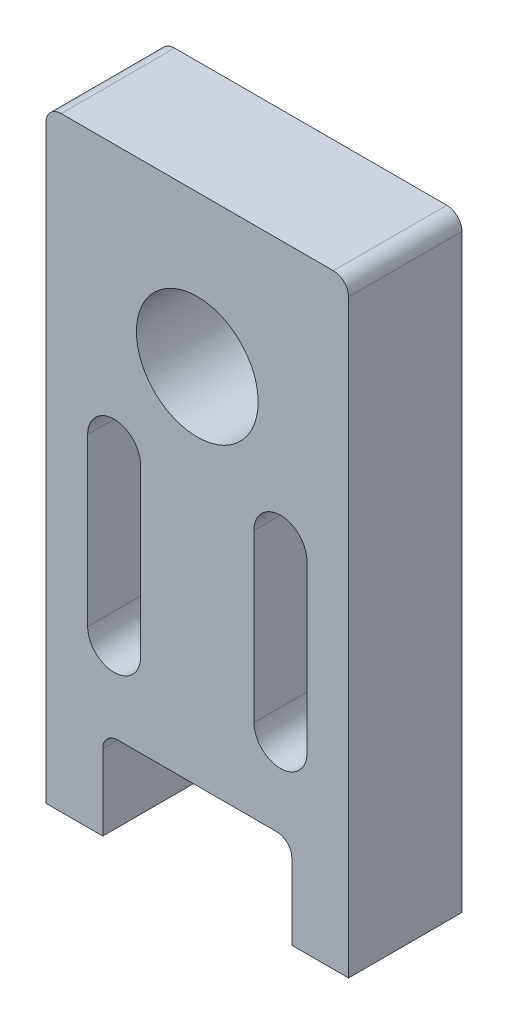
ISO-10303-21;
HEADER;
FILE_DESCRIPTION(('STEP AP214'),'2;1');
FILE_NAME('part.step','',(''),(''),'','','');
FILE_SCHEMA(('AUTOMOTIVE_DESIGN { 1 0 10303 214 1 1 1 1 }'));
ENDSEC;
DATA;
#1=APPLICATION_CONTEXT('core data for automotive mechanical design processes');
#2=APPLICATION_PROTOCOL_DEFINITION('international standard','automotive_design',2000,#1);
#3=PRODUCT_CONTEXT('',#1,'mechanical');
#4=PRODUCT('Part','Part','',(#3));
#5=PRODUCT_RELATED_PRODUCT_CATEGORY('part','',(#4));
#6=PRODUCT_DEFINITION_FORMATION('','',#4);
#7=PRODUCT_DEFINITION_CONTEXT('part definition',#1,'design');
#8=PRODUCT_DEFINITION('design','',#6,#7);
#9=PRODUCT_DEFINITION_SHAPE('','',#8);
#10=(LENGTH_UNIT() NAMED_UNIT(*) SI_UNIT(.MILLI.,.METRE.));
#11=(NAMED_UNIT(*) PLANE_ANGLE_UNIT() SI_UNIT($,.RADIAN.));
#12=(NAMED_UNIT(*) SI_UNIT($,.STERADIAN.) SOLID_ANGLE_UNIT());
#13=UNCERTAINTY_MEASURE_WITH_UNIT(LENGTH_MEASURE(1.E-05),#10,'distance_accuracy_value','');
#14=(GEOMETRIC_REPRESENTATION_CONTEXT(3) GLOBAL_UNCERTAINTY_ASSIGNED_CONTEXT((#13)) GLOBAL_UNIT_ASSIGNED_CONTEXT((#10,
#11,#12)) REPRESENTATION_CONTEXT('',''));
#15=CARTESIAN_POINT('',(0.,0.,0.));
#16=DIRECTION('',(0.,0.,1.));
#17=DIRECTION('',(1.,0.,0.));
#18=AXIS2_PLACEMENT_3D('',#15,#16,#17);
#19=CARTESIAN_POINT('',(-20.,-40.,15.));
#20=DIRECTION('',(0.,1.,0.));
#21=DIRECTION('',(0.,0.,1.));
#22=AXIS2_PLACEMENT_3D('',#19,#20,#21);
#23=PLANE('',#22);
#24=DIRECTION('',(1.,0.,0.));
#25=VECTOR('',#24,1.);
#26=CARTESIAN_POINT('',(-20.,-40.,15.));
#27=LINE('',#26,#25);
#28=CARTESIAN_POINT('',(12.5,-40.,15.));
#29=VERTEX_POINT('',#28);
#30=CARTESIAN_POINT('',(20.,-40.,15.));
#31=VERTEX_POINT('',#30);
#32=EDGE_CURVE('E293',#29,#31,#27,.T.);
#33=ORIENTED_EDGE('',*,*,#32,.F.);
#34=DIRECTION('',(0.,0.,-1.));
#35=VECTOR('',#34,1.);
#36=CARTESIAN_POINT('',(12.5,-40.,15.));
#37=LINE('',#36,#35);
#38=CARTESIAN_POINT('',(12.5,-40.,0.));
#39=VERTEX_POINT('',#38);
#40=EDGE_CURVE('E273',#29,#39,#37,.T.);
#41=ORIENTED_EDGE('',*,*,#40,.T.);
#42=DIRECTION('',(1.,0.,0.));
#43=VECTOR('',#42,1.);
#44=CARTESIAN_POINT('',(-20.,-40.,0.));
#45=LINE('',#44,#43);
#46=CARTESIAN_POINT('',(20.,-40.,0.));
#47=VERTEX_POINT('',#46);
#48=EDGE_CURVE('E315',#39,#47,#45,.T.);
#49=ORIENTED_EDGE('',*,*,#48,.T.);
#50=DIRECTION('',(0.,0.,-1.));
#51=VECTOR('',#50,1.);
#52=CARTESIAN_POINT('',(20.,-40.,15.));
#53=LINE('',#52,#51);
#54=EDGE_CURVE('E300',#31,#47,#53,.T.);
#55=ORIENTED_EDGE('',*,*,#54,.F.);
#56=EDGE_LOOP('',(#33,#41,#49,#55));
#57=FACE_BOUND('',#56,.T.);
#58=ADVANCED_FACE('F42',(#57),#23,.F.);
#59=CARTESIAN_POINT('',(0.,0.,15.));
#60=DIRECTION('',(0.,0.,-1.));
#61=DIRECTION('',(-1.,0.,0.));
#62=AXIS2_PLACEMENT_3D('',#59,#60,#61);
#63=PLANE('',#62);
#64=DIRECTION('',(0.,-1.,0.));
#65=VECTOR('',#64,1.);
#66=CARTESIAN_POINT('',(-14.5,5.,15.));
#67=LINE('',#66,#65);
#68=CARTESIAN_POINT('',(-14.5,5.,15.));
#69=VERTEX_POINT('',#68);
#70=CARTESIAN_POINT('',(-14.5,-17.,15.));
#71=VERTEX_POINT('',#70);
#72=EDGE_CURVE('E200',#69,#71,#67,.T.);
#73=ORIENTED_EDGE('',*,*,#72,.F.);
#74=CARTESIAN_POINT('',(-11.,5.,15.));
#75=DIRECTION('',(0.,0.,1.));
#76=DIRECTION('',(1.,0.,0.));
#77=AXIS2_PLACEMENT_3D('',#74,#75,#76);
#78=CIRCLE('',#77,3.5);
#79=CARTESIAN_POINT('',(-7.49999999999999,5.,15.));
#80=VERTEX_POINT('',#79);
#81=EDGE_CURVE('E202',#80,#69,#78,.T.);
#82=ORIENTED_EDGE('',*,*,#81,.F.);
#83=DIRECTION('',(0.,1.,0.));
#84=VECTOR('',#83,1.);
#85=CARTESIAN_POINT('',(-7.49999999999999,5.,15.));
#86=LINE('',#85,#84);
#87=CARTESIAN_POINT('',(-7.49999999999999,-17.,15.));
#88=VERTEX_POINT('',#87);
#89=EDGE_CURVE('E209',#88,#80,#86,.T.);
#90=ORIENTED_EDGE('',*,*,#89,.F.);
#91=CARTESIAN_POINT('',(-11.,-17.,15.));
#92=DIRECTION('',(0.,0.,1.));
#93=DIRECTION('',(1.,0.,0.));
#94=AXIS2_PLACEMENT_3D('',#91,#92,#93);
#95=CIRCLE('',#94,3.5);
#96=EDGE_CURVE('E187',#71,#88,#95,.T.);
#97=ORIENTED_EDGE('',*,*,#96,.F.);
#98=EDGE_LOOP('',(#73,#82,#90,#97));
#99=FACE_BOUND('',#98,.T.);
#100=DIRECTION('',(0.,-1.,0.));
#101=VECTOR('',#100,1.);
#102=CARTESIAN_POINT('',(7.5,5.,15.));
#103=LINE('',#102,#101);
#104=CARTESIAN_POINT('',(7.5,5.,15.));
#105=VERTEX_POINT('',#104);
#106=CARTESIAN_POINT('',(7.50000000000001,-17.,15.));
#107=VERTEX_POINT('',#106);
#108=EDGE_CURVE('E247',#105,#107,#103,.T.);
#109=ORIENTED_EDGE('',*,*,#108,.F.);
#110=CARTESIAN_POINT('',(11.,5.,15.));
#111=DIRECTION('',(0.,0.,1.));
#112=DIRECTION('',(1.,0.,0.));
#113=AXIS2_PLACEMENT_3D('',#110,#111,#112);
#114=CIRCLE('',#113,3.5);
#115=CARTESIAN_POINT('',(14.5,5.,15.));
#116=VERTEX_POINT('',#115);
#117=EDGE_CURVE('E246',#116,#105,#114,.T.);
#118=ORIENTED_EDGE('',*,*,#117,.F.);
#119=DIRECTION('',(0.,1.,0.));
#120=VECTOR('',#119,1.);
#121=CARTESIAN_POINT('',(14.5,5.,15.));
#122=LINE('',#121,#120);
#123=CARTESIAN_POINT('',(14.5,-17.,15.));
#124=VERTEX_POINT('',#123);
#125=EDGE_CURVE('E228',#124,#116,#122,.T.);
#126=ORIENTED_EDGE('',*,*,#125,.F.);
#127=CARTESIAN_POINT('',(11.,-17.,15.));
#128=DIRECTION('',(0.,0.,1.));
#129=DIRECTION('',(1.,0.,0.));
#130=AXIS2_PLACEMENT_3D('',#127,#128,#129);
#131=CIRCLE('',#130,3.5);
#132=EDGE_CURVE('E242',#107,#124,#131,.T.);
#133=ORIENTED_EDGE('',*,*,#132,.F.);
#134=EDGE_LOOP('',(#109,#118,#126,#133));
#135=FACE_BOUND('',#134,.T.);
#136=CARTESIAN_POINT('',(0.,20.,15.));
#137=DIRECTION('',(0.,0.,1.));
#138=DIRECTION('',(1.,0.,0.));
#139=AXIS2_PLACEMENT_3D('',#136,#137,#138);
#140=CIRCLE('',#139,8.05);
#141=CARTESIAN_POINT('',(8.05,20.,15.));
#142=VERTEX_POINT('',#141);
#143=EDGE_CURVE('E279',#142,#142,#140,.T.);
#144=ORIENTED_EDGE('',*,*,#143,.F.);
#145=EDGE_LOOP('',(#144));
#146=FACE_BOUND('',#145,.T.);
#147=DIRECTION('',(0.,1.,0.));
#148=VECTOR('',#147,1.);
#149=CARTESIAN_POINT('',(20.,-40.,15.));
#150=LINE('',#149,#148);
#151=CARTESIAN_POINT('',(20.,38.,15.));
#152=VERTEX_POINT('',#151);
#153=EDGE_CURVE('E284',#31,#152,#150,.T.);
#154=ORIENTED_EDGE('',*,*,#153,.T.);
#155=CARTESIAN_POINT('',(18.,38.,15.));
#156=DIRECTION('',(0.,0.,-1.));
#157=DIRECTION('',(-1.,0.,0.));
#158=AXIS2_PLACEMENT_3D('',#155,#156,#157);
#159=CIRCLE('',#158,2.);
#160=CARTESIAN_POINT('',(18.,40.,15.));
#161=VERTEX_POINT('',#160);
#162=EDGE_CURVE('E379',#152,#161,#159,.F.);
#163=ORIENTED_EDGE('',*,*,#162,.T.);
#164=DIRECTION('',(-1.,0.,0.));
#165=VECTOR('',#164,1.);
#166=CARTESIAN_POINT('',(-20.,40.,15.));
#167=LINE('',#166,#165);
#168=CARTESIAN_POINT('',(-18.,40.,15.));
#169=VERTEX_POINT('',#168);
#170=EDGE_CURVE('E290',#161,#169,#167,.T.);
#171=ORIENTED_EDGE('',*,*,#170,.T.);
#172=CARTESIAN_POINT('',(-18.,38.,15.));
#173=DIRECTION('',(0.,0.,-1.));
#174=DIRECTION('',(-1.,0.,0.));
#175=AXIS2_PLACEMENT_3D('',#172,#173,#174);
#176=CIRCLE('',#175,2.);
#177=CARTESIAN_POINT('',(-20.,38.,15.));
#178=VERTEX_POINT('',#177);
#179=EDGE_CURVE('E380',#169,#178,#176,.F.);
#180=ORIENTED_EDGE('',*,*,#179,.T.);
#181=DIRECTION('',(0.,-1.,0.));
#182=VECTOR('',#181,1.);
#183=CARTESIAN_POINT('',(-20.,-40.,15.));
#184=LINE('',#183,#182);
#185=CARTESIAN_POINT('',(-20.,-40.,15.));
#186=VERTEX_POINT('',#185);
#187=EDGE_CURVE('E295',#178,#186,#184,.T.);
#188=ORIENTED_EDGE('',*,*,#187,.T.);
#189=CARTESIAN_POINT('',(-12.5,-40.,15.));
#190=VERTEX_POINT('',#189);
#191=EDGE_CURVE('E296',#186,#190,#27,.T.);
#192=ORIENTED_EDGE('',*,*,#191,.T.);
#193=DIRECTION('',(0.,-1.,0.));
#194=VECTOR('',#193,1.);
#195=CARTESIAN_POINT('',(-12.5,-44.9693794312674,15.));
#196=LINE('',#195,#194);
#197=CARTESIAN_POINT('',(-12.5,-30.,15.));
#198=VERTEX_POINT('',#197);
#199=EDGE_CURVE('E270',#198,#190,#196,.T.);
#200=ORIENTED_EDGE('',*,*,#199,.F.);
#201=CARTESIAN_POINT('',(-10.5,-30.,15.));
#202=DIRECTION('',(0.,0.,-1.));
#203=DIRECTION('',(-1.,0.,0.));
#204=AXIS2_PLACEMENT_3D('',#201,#202,#203);
#205=CIRCLE('',#204,2.);
#206=CARTESIAN_POINT('',(-10.5,-28.,15.));
#207=VERTEX_POINT('',#206);
#208=EDGE_CURVE('E52',#198,#207,#205,.T.);
#209=ORIENTED_EDGE('',*,*,#208,.T.);
#210=DIRECTION('',(-1.,0.,0.));
#211=VECTOR('',#210,1.);
#212=CARTESIAN_POINT('',(-12.5,-28.,15.));
#213=LINE('',#212,#211);
#214=CARTESIAN_POINT('',(10.5,-28.,15.));
#215=VERTEX_POINT('',#214);
#216=EDGE_CURVE('E262',#215,#207,#213,.T.);
#217=ORIENTED_EDGE('',*,*,#216,.F.);
#218=CARTESIAN_POINT('',(10.5,-30.,15.));
#219=DIRECTION('',(0.,0.,-1.));
#220=DIRECTION('',(-1.,0.,0.));
#221=AXIS2_PLACEMENT_3D('',#218,#219,#220);
#222=CIRCLE('',#221,2.);
#223=CARTESIAN_POINT('',(12.5,-30.,15.));
#224=VERTEX_POINT('',#223);
#225=EDGE_CURVE('E70',#215,#224,#222,.T.);
#226=ORIENTED_EDGE('',*,*,#225,.T.);
#227=DIRECTION('',(0.,1.,0.));
#228=VECTOR('',#227,1.);
#229=CARTESIAN_POINT('',(12.5,-44.9693794312674,15.));
#230=LINE('',#229,#228);
#231=EDGE_CURVE('E260',#29,#224,#230,.T.);
#232=ORIENTED_EDGE('',*,*,#231,.F.);
#233=ORIENTED_EDGE('',*,*,#32,.T.);
#234=EDGE_LOOP('',(#154,#163,#171,#180,#188,#192,#200,#209,#217,#226,#232,#233));
#235=FACE_BOUND('',#234,.T.);
#236=ADVANCED_FACE('F210',(#99,#135,#146,#235),#63,.F.);
#237=CARTESIAN_POINT('',(20.,-40.,15.));
#238=DIRECTION('',(-1.,0.,0.));
#239=DIRECTION('',(0.,0.,1.));
#240=AXIS2_PLACEMENT_3D('',#237,#238,#239);
#241=PLANE('',#240);
#242=DIRECTION('',(0.,1.,0.));
#243=VECTOR('',#242,1.);
#244=CARTESIAN_POINT('',(20.,-40.,0.));
#245=LINE('',#244,#243);
#246=CARTESIAN_POINT('',(20.,38.,0.));
#247=VERTEX_POINT('',#246);
#248=EDGE_CURVE('E302',#47,#247,#245,.T.);
#249=ORIENTED_EDGE('',*,*,#248,.T.);
#250=DIRECTION('',(0.,0.,-1.));
#251=VECTOR('',#250,1.);
#252=CARTESIAN_POINT('',(20.,38.,15.));
#253=LINE('',#252,#251);
#254=EDGE_CURVE('E372',#247,#152,#253,.F.);
#255=ORIENTED_EDGE('',*,*,#254,.T.);
#256=ORIENTED_EDGE('',*,*,#153,.F.);
#257=ORIENTED_EDGE('',*,*,#54,.T.);
#258=EDGE_LOOP('',(#249,#255,#256,#257));
#259=FACE_BOUND('',#258,.T.);
#260=ADVANCED_FACE('F418',(#259),#241,.F.);
#261=CARTESIAN_POINT('',(-20.,40.,15.));
#262=DIRECTION('',(0.,-1.,0.));
#263=DIRECTION('',(0.,0.,-1.));
#264=AXIS2_PLACEMENT_3D('',#261,#262,#263);
#265=PLANE('',#264);
#266=ORIENTED_EDGE('',*,*,#170,.F.);
#267=DIRECTION('',(0.,0.,-1.));
#268=VECTOR('',#267,1.);
#269=CARTESIAN_POINT('',(18.,40.,15.));
#270=LINE('',#269,#268);
#271=CARTESIAN_POINT('',(18.,40.,0.));
#272=VERTEX_POINT('',#271);
#273=EDGE_CURVE('E365',#161,#272,#270,.T.);
#274=ORIENTED_EDGE('',*,*,#273,.T.);
#275=DIRECTION('',(-1.,0.,0.));
#276=VECTOR('',#275,1.);
#277=CARTESIAN_POINT('',(-20.,40.,0.));
#278=LINE('',#277,#276);
#279=CARTESIAN_POINT('',(-18.,40.,0.));
#280=VERTEX_POINT('',#279);
#281=EDGE_CURVE('E301',#272,#280,#278,.T.);
#282=ORIENTED_EDGE('',*,*,#281,.T.);
#283=DIRECTION('',(0.,0.,-1.));
#284=VECTOR('',#283,1.);
#285=CARTESIAN_POINT('',(-18.,40.,15.));
#286=LINE('',#285,#284);
#287=EDGE_CURVE('E363',#280,#169,#286,.F.);
#288=ORIENTED_EDGE('',*,*,#287,.T.);
#289=EDGE_LOOP('',(#266,#274,#282,#288));
#290=FACE_BOUND('',#289,.T.);
#291=ADVANCED_FACE('F430',(#290),#265,.F.);
#292=CARTESIAN_POINT('',(-20.,-40.,15.));
#293=DIRECTION('',(1.,0.,0.));
#294=DIRECTION('',(0.,0.,-1.));
#295=AXIS2_PLACEMENT_3D('',#292,#293,#294);
#296=PLANE('',#295);
#297=ORIENTED_EDGE('',*,*,#187,.F.);
#298=DIRECTION('',(0.,0.,-1.));
#299=VECTOR('',#298,1.);
#300=CARTESIAN_POINT('',(-20.,38.,15.));
#301=LINE('',#300,#299);
#302=CARTESIAN_POINT('',(-20.,38.,0.));
#303=VERTEX_POINT('',#302);
#304=EDGE_CURVE('E382',#178,#303,#301,.T.);
#305=ORIENTED_EDGE('',*,*,#304,.T.);
#306=DIRECTION('',(0.,-1.,0.));
#307=VECTOR('',#306,1.);
#308=CARTESIAN_POINT('',(-20.,-40.,0.));
#309=LINE('',#308,#307);
#310=CARTESIAN_POINT('',(-20.,-40.,0.));
#311=VERTEX_POINT('',#310);
#312=EDGE_CURVE('E310',#303,#311,#309,.T.);
#313=ORIENTED_EDGE('',*,*,#312,.T.);
#314=DIRECTION('',(0.,0.,-1.));
#315=VECTOR('',#314,1.);
#316=CARTESIAN_POINT('',(-20.,-40.,15.));
#317=LINE('',#316,#315);
#318=EDGE_CURVE('E317',#186,#311,#317,.T.);
#319=ORIENTED_EDGE('',*,*,#318,.F.);
#320=EDGE_LOOP('',(#297,#305,#313,#319));
#321=FACE_BOUND('',#320,.T.);
#322=ADVANCED_FACE('F436',(#321),#296,.F.);
#323=CARTESIAN_POINT('',(-12.5,-40.,0.));
#324=VERTEX_POINT('',#323);
#325=EDGE_CURVE('E288',#311,#324,#45,.T.);
#326=ORIENTED_EDGE('',*,*,#325,.T.);
#327=DIRECTION('',(0.,0.,1.));
#328=VECTOR('',#327,1.);
#329=CARTESIAN_POINT('',(-12.5,-40.,15.));
#330=LINE('',#329,#328);
#331=EDGE_CURVE('E269',#324,#190,#330,.T.);
#332=ORIENTED_EDGE('',*,*,#331,.T.);
#333=ORIENTED_EDGE('',*,*,#191,.F.);
#334=ORIENTED_EDGE('',*,*,#318,.T.);
#335=EDGE_LOOP('',(#326,#332,#333,#334));
#336=FACE_BOUND('',#335,.T.);
#337=ADVANCED_FACE('F442',(#336),#23,.F.);
#338=CARTESIAN_POINT('',(0.,0.,0.));
#339=DIRECTION('',(0.,0.,-1.));
#340=DIRECTION('',(-1.,0.,0.));
#341=AXIS2_PLACEMENT_3D('',#338,#339,#340);
#342=PLANE('',#341);
#343=CARTESIAN_POINT('',(-11.,5.,0.));
#344=DIRECTION('',(0.,0.,-1.));
#345=DIRECTION('',(-1.,0.,0.));
#346=AXIS2_PLACEMENT_3D('',#343,#344,#345);
#347=CIRCLE('',#346,3.5);
#348=CARTESIAN_POINT('',(-14.5,5.,0.));
#349=VERTEX_POINT('',#348);
#350=CARTESIAN_POINT('',(-7.49999999999999,5.,0.));
#351=VERTEX_POINT('',#350);
#352=EDGE_CURVE('E358',#349,#351,#347,.T.);
#353=ORIENTED_EDGE('',*,*,#352,.F.);
#354=DIRECTION('',(0.,1.,0.));
#355=VECTOR('',#354,1.);
#356=CARTESIAN_POINT('',(-14.5,0.,0.));
#357=LINE('',#356,#355);
#358=CARTESIAN_POINT('',(-14.5,-17.,0.));
#359=VERTEX_POINT('',#358);
#360=EDGE_CURVE('E348',#359,#349,#357,.T.);
#361=ORIENTED_EDGE('',*,*,#360,.F.);
#362=CARTESIAN_POINT('',(-11.,-17.,0.));
#363=DIRECTION('',(0.,0.,-1.));
#364=DIRECTION('',(-1.,0.,0.));
#365=AXIS2_PLACEMENT_3D('',#362,#363,#364);
#366=CIRCLE('',#365,3.5);
#367=CARTESIAN_POINT('',(-7.49999999999999,-17.,0.));
#368=VERTEX_POINT('',#367);
#369=EDGE_CURVE('E190',#368,#359,#366,.T.);
#370=ORIENTED_EDGE('',*,*,#369,.F.);
#371=DIRECTION('',(0.,-1.,0.));
#372=VECTOR('',#371,1.);
#373=CARTESIAN_POINT('',(-7.49999999999999,0.,0.));
#374=LINE('',#373,#372);
#375=EDGE_CURVE('E355',#351,#368,#374,.T.);
#376=ORIENTED_EDGE('',*,*,#375,.F.);
#377=EDGE_LOOP('',(#353,#361,#370,#376));
#378=FACE_BOUND('',#377,.T.);
#379=CARTESIAN_POINT('',(11.,5.,0.));
#380=DIRECTION('',(0.,0.,-1.));
#381=DIRECTION('',(-1.,0.,0.));
#382=AXIS2_PLACEMENT_3D('',#379,#380,#381);
#383=CIRCLE('',#382,3.5);
#384=CARTESIAN_POINT('',(7.5,5.,0.));
#385=VERTEX_POINT('',#384);
#386=CARTESIAN_POINT('',(14.5,5.,0.));
#387=VERTEX_POINT('',#386);
#388=EDGE_CURVE('E350',#385,#387,#383,.T.);
#389=ORIENTED_EDGE('',*,*,#388,.F.);
#390=DIRECTION('',(0.,1.,0.));
#391=VECTOR('',#390,1.);
#392=CARTESIAN_POINT('',(7.5,0.,0.));
#393=LINE('',#392,#391);
#394=CARTESIAN_POINT('',(7.50000000000001,-17.,0.));
#395=VERTEX_POINT('',#394);
#396=EDGE_CURVE('E337',#395,#385,#393,.T.);
#397=ORIENTED_EDGE('',*,*,#396,.F.);
#398=CARTESIAN_POINT('',(11.,-17.,0.));
#399=DIRECTION('',(0.,0.,-1.));
#400=DIRECTION('',(-1.,0.,0.));
#401=AXIS2_PLACEMENT_3D('',#398,#399,#400);
#402=CIRCLE('',#401,3.5);
#403=CARTESIAN_POINT('',(14.5,-17.,0.));
#404=VERTEX_POINT('',#403);
#405=EDGE_CURVE('E340',#404,#395,#402,.T.);
#406=ORIENTED_EDGE('',*,*,#405,.F.);
#407=DIRECTION('',(0.,-1.,0.));
#408=VECTOR('',#407,1.);
#409=CARTESIAN_POINT('',(14.5,0.,0.));
#410=LINE('',#409,#408);
#411=EDGE_CURVE('E344',#387,#404,#410,.T.);
#412=ORIENTED_EDGE('',*,*,#411,.F.);
#413=EDGE_LOOP('',(#389,#397,#406,#412));
#414=FACE_BOUND('',#413,.T.);
#415=ORIENTED_EDGE('',*,*,#281,.F.);
#416=CARTESIAN_POINT('',(18.,38.,0.));
#417=DIRECTION('',(0.,0.,-1.));
#418=DIRECTION('',(-1.,0.,0.));
#419=AXIS2_PLACEMENT_3D('',#416,#417,#418);
#420=CIRCLE('',#419,2.);
#421=EDGE_CURVE('E371',#272,#247,#420,.T.);
#422=ORIENTED_EDGE('',*,*,#421,.T.);
#423=ORIENTED_EDGE('',*,*,#248,.F.);
#424=ORIENTED_EDGE('',*,*,#48,.F.);
#425=DIRECTION('',(0.,-1.,0.));
#426=VECTOR('',#425,1.);
#427=CARTESIAN_POINT('',(12.5,0.,0.));
#428=LINE('',#427,#426);
#429=CARTESIAN_POINT('',(12.5,-30.,0.));
#430=VERTEX_POINT('',#429);
#431=EDGE_CURVE('E331',#430,#39,#428,.T.);
#432=ORIENTED_EDGE('',*,*,#431,.F.);
#433=CARTESIAN_POINT('',(10.5,-30.,0.));
#434=DIRECTION('',(0.,0.,-1.));
#435=DIRECTION('',(-1.,0.,0.));
#436=AXIS2_PLACEMENT_3D('',#433,#434,#435);
#437=CIRCLE('',#436,2.);
#438=CARTESIAN_POINT('',(10.5,-28.,0.));
#439=VERTEX_POINT('',#438);
#440=EDGE_CURVE('E405',#430,#439,#437,.F.);
#441=ORIENTED_EDGE('',*,*,#440,.T.);
#442=DIRECTION('',(1.,0.,0.));
#443=VECTOR('',#442,1.);
#444=CARTESIAN_POINT('',(0.,-28.,0.));
#445=LINE('',#444,#443);
#446=CARTESIAN_POINT('',(-10.5,-28.,0.));
#447=VERTEX_POINT('',#446);
#448=EDGE_CURVE('E323',#447,#439,#445,.T.);
#449=ORIENTED_EDGE('',*,*,#448,.F.);
#450=CARTESIAN_POINT('',(-10.5,-30.,0.));
#451=DIRECTION('',(0.,0.,-1.));
#452=DIRECTION('',(-1.,0.,0.));
#453=AXIS2_PLACEMENT_3D('',#450,#451,#452);
#454=CIRCLE('',#453,2.);
#455=CARTESIAN_POINT('',(-12.5,-30.,0.));
#456=VERTEX_POINT('',#455);
#457=EDGE_CURVE('E11',#447,#456,#454,.F.);
#458=ORIENTED_EDGE('',*,*,#457,.T.);
#459=DIRECTION('',(0.,1.,0.));
#460=VECTOR('',#459,1.);
#461=CARTESIAN_POINT('',(-12.5,0.,0.));
#462=LINE('',#461,#460);
#463=EDGE_CURVE('E329',#324,#456,#462,.T.);
#464=ORIENTED_EDGE('',*,*,#463,.F.);
#465=ORIENTED_EDGE('',*,*,#325,.F.);
#466=ORIENTED_EDGE('',*,*,#312,.F.);
#467=CARTESIAN_POINT('',(-18.,38.,0.));
#468=DIRECTION('',(0.,0.,-1.));
#469=DIRECTION('',(-1.,0.,0.));
#470=AXIS2_PLACEMENT_3D('',#467,#468,#469);
#471=CIRCLE('',#470,2.);
#472=EDGE_CURVE('E366',#303,#280,#471,.T.);
#473=ORIENTED_EDGE('',*,*,#472,.T.);
#474=EDGE_LOOP('',(#415,#422,#423,#424,#432,#441,#449,#458,#464,#465,#466,#473));
#475=FACE_BOUND('',#474,.T.);
#476=CARTESIAN_POINT('',(0.,20.,0.));
#477=DIRECTION('',(0.,0.,-1.));
#478=DIRECTION('',(-1.,0.,0.));
#479=AXIS2_PLACEMENT_3D('',#476,#477,#478);
#480=CIRCLE('',#479,8.05);
#481=CARTESIAN_POINT('',(-8.05,20.,0.));
#482=VERTEX_POINT('',#481);
#483=EDGE_CURVE('E282',#482,#482,#480,.T.);
#484=ORIENTED_EDGE('',*,*,#483,.F.);
#485=EDGE_LOOP('',(#484));
#486=FACE_BOUND('',#485,.T.);
#487=ADVANCED_FACE('F420',(#378,#414,#475,#486),#342,.T.);
#488=CARTESIAN_POINT('',(0.,20.,-45.));
#489=DIRECTION('',(0.,0.,1.));
#490=DIRECTION('',(1.,0.,0.));
#491=AXIS2_PLACEMENT_3D('',#488,#489,#490);
#492=CYLINDRICAL_SURFACE('',#491,8.05);
#493=ORIENTED_EDGE('',*,*,#483,.T.);
#494=EDGE_LOOP('',(#493));
#495=FACE_BOUND('',#494,.T.);
#496=ORIENTED_EDGE('',*,*,#143,.T.);
#497=EDGE_LOOP('',(#496));
#498=FACE_BOUND('',#497,.T.);
#499=ADVANCED_FACE('F456',(#495,#498),#492,.F.);
#500=CARTESIAN_POINT('',(12.5,-44.9693794312674,-45.));
#501=DIRECTION('',(1.,0.,0.));
#502=DIRECTION('',(0.,0.,-1.));
#503=AXIS2_PLACEMENT_3D('',#500,#501,#502);
#504=PLANE('',#503);
#505=ORIENTED_EDGE('',*,*,#231,.T.);
#506=DIRECTION('',(0.,0.,1.));
#507=VECTOR('',#506,1.);
#508=CARTESIAN_POINT('',(12.5,-30.,0.));
#509=LINE('',#508,#507);
#510=EDGE_CURVE('E394',#224,#430,#509,.F.);
#511=ORIENTED_EDGE('',*,*,#510,.T.);
#512=ORIENTED_EDGE('',*,*,#431,.T.);
#513=ORIENTED_EDGE('',*,*,#40,.F.);
#514=EDGE_LOOP('',(#505,#511,#512,#513));
#515=FACE_BOUND('',#514,.T.);
#516=ADVANCED_FACE('F457',(#515),#504,.F.);
#517=CARTESIAN_POINT('',(-12.5,-44.9693794312674,-45.));
#518=DIRECTION('',(-1.,0.,0.));
#519=DIRECTION('',(0.,0.,1.));
#520=AXIS2_PLACEMENT_3D('',#517,#518,#519);
#521=PLANE('',#520);
#522=ORIENTED_EDGE('',*,*,#463,.T.);
#523=DIRECTION('',(0.,0.,1.));
#524=VECTOR('',#523,1.);
#525=CARTESIAN_POINT('',(-12.5,-30.,15.));
#526=LINE('',#525,#524);
#527=EDGE_CURVE('E397',#456,#198,#526,.T.);
#528=ORIENTED_EDGE('',*,*,#527,.T.);
#529=ORIENTED_EDGE('',*,*,#199,.T.);
#530=ORIENTED_EDGE('',*,*,#331,.F.);
#531=EDGE_LOOP('',(#522,#528,#529,#530));
#532=FACE_BOUND('',#531,.T.);
#533=ADVANCED_FACE('F441',(#532),#521,.F.);
#534=CARTESIAN_POINT('',(-12.5,-28.,-45.));
#535=DIRECTION('',(0.,1.,0.));
#536=DIRECTION('',(0.,0.,1.));
#537=AXIS2_PLACEMENT_3D('',#534,#535,#536);
#538=PLANE('',#537);
#539=CARTESIAN_POINT('',(0.,-28.,7.5));
#540=DIRECTION('',(0.,-1.,0.));
#541=DIRECTION('',(0.,0.,-1.));
#542=AXIS2_PLACEMENT_3D('',#539,#540,#541);
#543=CIRCLE('',#542,1.45);
#544=CARTESIAN_POINT('',(0.,-28.,6.05));
#545=VERTEX_POINT('',#544);
#546=EDGE_CURVE('E219',#545,#545,#543,.T.);
#547=ORIENTED_EDGE('',*,*,#546,.F.);
#548=EDGE_LOOP('',(#547));
#549=FACE_BOUND('',#548,.T.);
#550=ORIENTED_EDGE('',*,*,#448,.T.);
#551=DIRECTION('',(0.,0.,1.));
#552=VECTOR('',#551,1.);
#553=CARTESIAN_POINT('',(10.5,-28.,15.));
#554=LINE('',#553,#552);
#555=EDGE_CURVE('E388',#439,#215,#554,.T.);
#556=ORIENTED_EDGE('',*,*,#555,.T.);
#557=ORIENTED_EDGE('',*,*,#216,.T.);
#558=DIRECTION('',(0.,0.,1.));
#559=VECTOR('',#558,1.);
#560=CARTESIAN_POINT('',(-10.5,-28.,0.));
#561=LINE('',#560,#559);
#562=EDGE_CURVE('E390',#207,#447,#561,.F.);
#563=ORIENTED_EDGE('',*,*,#562,.T.);
#564=EDGE_LOOP('',(#550,#556,#557,#563));
#565=FACE_BOUND('',#564,.T.);
#566=ADVANCED_FACE('F452',(#549,#565),#538,.F.);
#567=CARTESIAN_POINT('',(0.,7.,7.5));
#568=DIRECTION('',(0.,-1.,0.));
#569=DIRECTION('',(0.,0.,-1.));
#570=AXIS2_PLACEMENT_3D('',#567,#568,#569);
#571=CYLINDRICAL_SURFACE('',#570,1.45);
#572=CARTESIAN_POINT('',(0.,7.,7.5));
#573=DIRECTION('',(0.,-1.,0.));
#574=DIRECTION('',(0.,0.,-1.));
#575=AXIS2_PLACEMENT_3D('',#572,#573,#574);
#576=CIRCLE('',#575,1.45);
#577=CARTESIAN_POINT('',(0.,7.,6.05));
#578=VERTEX_POINT('',#577);
#579=EDGE_CURVE('E251',#578,#578,#576,.T.);
#580=ORIENTED_EDGE('',*,*,#579,.F.);
#581=EDGE_LOOP('',(#580));
#582=FACE_BOUND('',#581,.T.);
#583=ORIENTED_EDGE('',*,*,#546,.T.);
#584=EDGE_LOOP('',(#583));
#585=FACE_BOUND('',#584,.T.);
#586=ADVANCED_FACE('F602',(#582,#585),#571,.F.);
#587=CARTESIAN_POINT('',(0.,7.,7.5));
#588=DIRECTION('',(0.,-1.,0.));
#589=DIRECTION('',(0.,0.,-1.));
#590=AXIS2_PLACEMENT_3D('',#587,#588,#589);
#591=PLANE('',#590);
#592=ORIENTED_EDGE('',*,*,#579,.T.);
#593=EDGE_LOOP('',(#592));
#594=FACE_BOUND('',#593,.T.);
#595=ADVANCED_FACE('F593',(#594),#591,.T.);
#596=CARTESIAN_POINT('',(11.,5.,-20.));
#597=DIRECTION('',(0.,0.,1.));
#598=DIRECTION('',(1.,0.,0.));
#599=AXIS2_PLACEMENT_3D('',#596,#597,#598);
#600=CYLINDRICAL_SURFACE('',#599,3.5);
#601=ORIENTED_EDGE('',*,*,#388,.T.);
#602=DIRECTION('',(0.,0.,1.));
#603=VECTOR('',#602,1.);
#604=CARTESIAN_POINT('',(14.5,5.,-20.));
#605=LINE('',#604,#603);
#606=EDGE_CURVE('E237',#387,#116,#605,.T.);
#607=ORIENTED_EDGE('',*,*,#606,.T.);
#608=ORIENTED_EDGE('',*,*,#117,.T.);
#609=DIRECTION('',(0.,0.,1.));
#610=VECTOR('',#609,1.);
#611=CARTESIAN_POINT('',(7.5,5.,-20.));
#612=LINE('',#611,#610);
#613=EDGE_CURVE('E223',#385,#105,#612,.T.);
#614=ORIENTED_EDGE('',*,*,#613,.F.);
#615=EDGE_LOOP('',(#601,#607,#608,#614));
#616=FACE_BOUND('',#615,.T.);
#617=ADVANCED_FACE('F581',(#616),#600,.F.);
#618=CARTESIAN_POINT('',(14.5,5.,-20.));
#619=DIRECTION('',(1.,0.,0.));
#620=DIRECTION('',(0.,1.,0.));
#621=AXIS2_PLACEMENT_3D('',#618,#619,#620);
#622=PLANE('',#621);
#623=ORIENTED_EDGE('',*,*,#411,.T.);
#624=DIRECTION('',(0.,0.,1.));
#625=VECTOR('',#624,1.);
#626=CARTESIAN_POINT('',(14.5,-17.,-20.));
#627=LINE('',#626,#625);
#628=EDGE_CURVE('E233',#404,#124,#627,.T.);
#629=ORIENTED_EDGE('',*,*,#628,.T.);
#630=ORIENTED_EDGE('',*,*,#125,.T.);
#631=ORIENTED_EDGE('',*,*,#606,.F.);
#632=EDGE_LOOP('',(#623,#629,#630,#631));
#633=FACE_BOUND('',#632,.T.);
#634=ADVANCED_FACE('F574',(#633),#622,.F.);
#635=CARTESIAN_POINT('',(11.,-17.,-20.));
#636=DIRECTION('',(0.,0.,1.));
#637=DIRECTION('',(1.,0.,0.));
#638=AXIS2_PLACEMENT_3D('',#635,#636,#637);
#639=CYLINDRICAL_SURFACE('',#638,3.5);
#640=ORIENTED_EDGE('',*,*,#405,.T.);
#641=DIRECTION('',(0.,0.,1.));
#642=VECTOR('',#641,1.);
#643=CARTESIAN_POINT('',(7.50000000000001,-17.,-20.));
#644=LINE('',#643,#642);
#645=EDGE_CURVE('E230',#395,#107,#644,.T.);
#646=ORIENTED_EDGE('',*,*,#645,.T.);
#647=ORIENTED_EDGE('',*,*,#132,.T.);
#648=ORIENTED_EDGE('',*,*,#628,.F.);
#649=EDGE_LOOP('',(#640,#646,#647,#648));
#650=FACE_BOUND('',#649,.T.);
#651=ADVANCED_FACE('F563',(#650),#639,.F.);
#652=CARTESIAN_POINT('',(7.5,5.,-20.));
#653=DIRECTION('',(-1.,0.,0.));
#654=DIRECTION('',(0.,-1.,0.));
#655=AXIS2_PLACEMENT_3D('',#652,#653,#654);
#656=PLANE('',#655);
#657=ORIENTED_EDGE('',*,*,#396,.T.);
#658=ORIENTED_EDGE('',*,*,#613,.T.);
#659=ORIENTED_EDGE('',*,*,#108,.T.);
#660=ORIENTED_EDGE('',*,*,#645,.F.);
#661=EDGE_LOOP('',(#657,#658,#659,#660));
#662=FACE_BOUND('',#661,.T.);
#663=ADVANCED_FACE('F554',(#662),#656,.F.);
#664=CARTESIAN_POINT('',(-11.,5.,-20.));
#665=DIRECTION('',(0.,0.,1.));
#666=DIRECTION('',(1.,0.,0.));
#667=AXIS2_PLACEMENT_3D('',#664,#665,#666);
#668=CYLINDRICAL_SURFACE('',#667,3.5);
#669=ORIENTED_EDGE('',*,*,#352,.T.);
#670=DIRECTION('',(0.,0.,1.));
#671=VECTOR('',#670,1.);
#672=CARTESIAN_POINT('',(-7.49999999999999,5.,-20.));
#673=LINE('',#672,#671);
#674=EDGE_CURVE('E220',#351,#80,#673,.T.);
#675=ORIENTED_EDGE('',*,*,#674,.T.);
#676=ORIENTED_EDGE('',*,*,#81,.T.);
#677=DIRECTION('',(0.,0.,1.));
#678=VECTOR('',#677,1.);
#679=CARTESIAN_POINT('',(-14.5,5.,-20.));
#680=LINE('',#679,#678);
#681=EDGE_CURVE('E191',#349,#69,#680,.T.);
#682=ORIENTED_EDGE('',*,*,#681,.F.);
#683=EDGE_LOOP('',(#669,#675,#676,#682));
#684=FACE_BOUND('',#683,.T.);
#685=ADVANCED_FACE('F543',(#684),#668,.F.);
#686=CARTESIAN_POINT('',(-7.49999999999999,5.,-20.));
#687=DIRECTION('',(1.,0.,0.));
#688=DIRECTION('',(0.,1.,0.));
#689=AXIS2_PLACEMENT_3D('',#686,#687,#688);
#690=PLANE('',#689);
#691=ORIENTED_EDGE('',*,*,#375,.T.);
#692=DIRECTION('',(0.,0.,1.));
#693=VECTOR('',#692,1.);
#694=CARTESIAN_POINT('',(-7.49999999999999,-17.,-20.));
#695=LINE('',#694,#693);
#696=EDGE_CURVE('E194',#368,#88,#695,.T.);
#697=ORIENTED_EDGE('',*,*,#696,.T.);
#698=ORIENTED_EDGE('',*,*,#89,.T.);
#699=ORIENTED_EDGE('',*,*,#674,.F.);
#700=EDGE_LOOP('',(#691,#697,#698,#699));
#701=FACE_BOUND('',#700,.T.);
#702=ADVANCED_FACE('F534',(#701),#690,.F.);
#703=CARTESIAN_POINT('',(-11.,-17.,-20.));
#704=DIRECTION('',(0.,0.,1.));
#705=DIRECTION('',(1.,0.,0.));
#706=AXIS2_PLACEMENT_3D('',#703,#704,#705);
#707=CYLINDRICAL_SURFACE('',#706,3.5);
#708=ORIENTED_EDGE('',*,*,#369,.T.);
#709=DIRECTION('',(0.,0.,1.));
#710=VECTOR('',#709,1.);
#711=CARTESIAN_POINT('',(-14.5,-17.,-20.));
#712=LINE('',#711,#710);
#713=EDGE_CURVE('E185',#359,#71,#712,.T.);
#714=ORIENTED_EDGE('',*,*,#713,.T.);
#715=ORIENTED_EDGE('',*,*,#96,.T.);
#716=ORIENTED_EDGE('',*,*,#696,.F.);
#717=EDGE_LOOP('',(#708,#714,#715,#716));
#718=FACE_BOUND('',#717,.T.);
#719=ADVANCED_FACE('F184',(#718),#707,.F.);
#720=CARTESIAN_POINT('',(-14.5,5.,-20.));
#721=DIRECTION('',(-1.,0.,0.));
#722=DIRECTION('',(0.,-1.,0.));
#723=AXIS2_PLACEMENT_3D('',#720,#721,#722);
#724=PLANE('',#723);
#725=ORIENTED_EDGE('',*,*,#360,.T.);
#726=ORIENTED_EDGE('',*,*,#681,.T.);
#727=ORIENTED_EDGE('',*,*,#72,.T.);
#728=ORIENTED_EDGE('',*,*,#713,.F.);
#729=EDGE_LOOP('',(#725,#726,#727,#728));
#730=FACE_BOUND('',#729,.T.);
#731=ADVANCED_FACE('F199',(#730),#724,.F.);
#732=CARTESIAN_POINT('',(18.,38.,15.));
#733=DIRECTION('',(0.,0.,-1.));
#734=DIRECTION('',(-1.,0.,0.));
#735=AXIS2_PLACEMENT_3D('',#732,#733,#734);
#736=CYLINDRICAL_SURFACE('',#735,2.);
#737=ORIENTED_EDGE('',*,*,#162,.F.);
#738=ORIENTED_EDGE('',*,*,#254,.F.);
#739=ORIENTED_EDGE('',*,*,#421,.F.);
#740=ORIENTED_EDGE('',*,*,#273,.F.);
#741=EDGE_LOOP('',(#737,#738,#739,#740));
#742=FACE_BOUND('',#741,.T.);
#743=ADVANCED_FACE('F424',(#742),#736,.T.);
#744=CARTESIAN_POINT('',(-18.,38.,15.));
#745=DIRECTION('',(0.,0.,-1.));
#746=DIRECTION('',(-1.,0.,0.));
#747=AXIS2_PLACEMENT_3D('',#744,#745,#746);
#748=CYLINDRICAL_SURFACE('',#747,2.);
#749=ORIENTED_EDGE('',*,*,#179,.F.);
#750=ORIENTED_EDGE('',*,*,#287,.F.);
#751=ORIENTED_EDGE('',*,*,#472,.F.);
#752=ORIENTED_EDGE('',*,*,#304,.F.);
#753=EDGE_LOOP('',(#749,#750,#751,#752));
#754=FACE_BOUND('',#753,.T.);
#755=ADVANCED_FACE('F433',(#754),#748,.T.);
#756=CARTESIAN_POINT('',(10.5,-30.,-45.));
#757=DIRECTION('',(0.,0.,-1.));
#758=DIRECTION('',(-1.,0.,0.));
#759=AXIS2_PLACEMENT_3D('',#756,#757,#758);
#760=CYLINDRICAL_SURFACE('',#759,2.);
#761=ORIENTED_EDGE('',*,*,#440,.F.);
#762=ORIENTED_EDGE('',*,*,#510,.F.);
#763=ORIENTED_EDGE('',*,*,#225,.F.);
#764=ORIENTED_EDGE('',*,*,#555,.F.);
#765=EDGE_LOOP('',(#761,#762,#763,#764));
#766=FACE_BOUND('',#765,.T.);
#767=ADVANCED_FACE('F453',(#766),#760,.F.);
#768=CARTESIAN_POINT('',(-10.5,-30.,-45.));
#769=DIRECTION('',(0.,0.,-1.));
#770=DIRECTION('',(-1.,0.,0.));
#771=AXIS2_PLACEMENT_3D('',#768,#769,#770);
#772=CYLINDRICAL_SURFACE('',#771,2.);
#773=ORIENTED_EDGE('',*,*,#457,.F.);
#774=ORIENTED_EDGE('',*,*,#562,.F.);
#775=ORIENTED_EDGE('',*,*,#208,.F.);
#776=ORIENTED_EDGE('',*,*,#527,.F.);
#777=EDGE_LOOP('',(#773,#774,#775,#776));
#778=FACE_BOUND('',#777,.T.);
#779=ADVANCED_FACE('F46',(#778),#772,.F.);
#780=CLOSED_SHELL('',(#58,#236,#260,#291,#322,#337,#487,#499,#516,#533,#566,#586,#595,#617,#634,
#651,#663,#685,#702,#719,#731,#743,#755,#767,#779));
#781=MANIFOLD_SOLID_BREP('B2',#780);
#782=ADVANCED_BREP_SHAPE_REPRESENTATION('',(#18,#781),#14);
#783=SHAPE_DEFINITION_REPRESENTATION(#9,#782);
ENDSEC;
END-ISO-10303-21;
